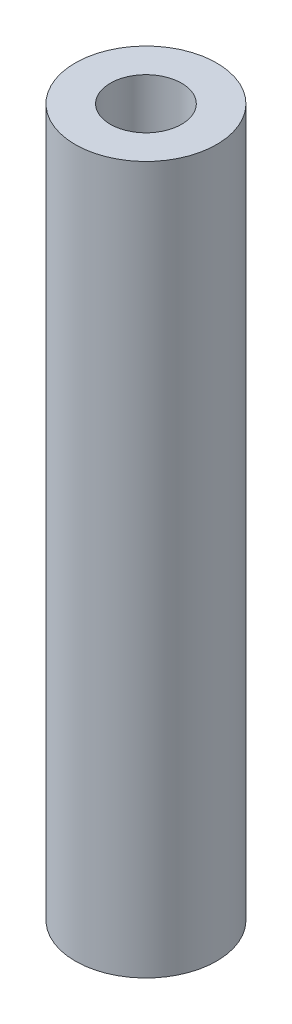
ISO-10303-21;
HEADER;
FILE_DESCRIPTION(('STEP AP214'),'2;1');
FILE_NAME('part.step','',(''),(''),'','','');
FILE_SCHEMA(('AUTOMOTIVE_DESIGN { 1 0 10303 214 1 1 1 1 }'));
ENDSEC;
DATA;
#1=APPLICATION_CONTEXT('core data for automotive mechanical design processes');
#2=APPLICATION_PROTOCOL_DEFINITION('international standard','automotive_design',2000,#1);
#3=PRODUCT_CONTEXT('',#1,'mechanical');
#4=PRODUCT('Part','Part','',(#3));
#5=PRODUCT_RELATED_PRODUCT_CATEGORY('part','',(#4));
#6=PRODUCT_DEFINITION_FORMATION('','',#4);
#7=PRODUCT_DEFINITION_CONTEXT('part definition',#1,'design');
#8=PRODUCT_DEFINITION('design','',#6,#7);
#9=PRODUCT_DEFINITION_SHAPE('','',#8);
#10=(LENGTH_UNIT() NAMED_UNIT(*) SI_UNIT(.MILLI.,.METRE.));
#11=(NAMED_UNIT(*) PLANE_ANGLE_UNIT() SI_UNIT($,.RADIAN.));
#12=(NAMED_UNIT(*) SI_UNIT($,.STERADIAN.) SOLID_ANGLE_UNIT());
#13=UNCERTAINTY_MEASURE_WITH_UNIT(LENGTH_MEASURE(1.E-05),#10,'distance_accuracy_value','');
#14=(GEOMETRIC_REPRESENTATION_CONTEXT(3) GLOBAL_UNCERTAINTY_ASSIGNED_CONTEXT((#13)) GLOBAL_UNIT_ASSIGNED_CONTEXT((#10,
#11,#12)) REPRESENTATION_CONTEXT('',''));
#15=CARTESIAN_POINT('',(0.,0.,0.));
#16=DIRECTION('',(0.,0.,1.));
#17=DIRECTION('',(1.,0.,0.));
#18=AXIS2_PLACEMENT_3D('',#15,#16,#17);
#19=CARTESIAN_POINT('',(0.,63.5,0.));
#20=DIRECTION('',(0.,1.,0.));
#21=DIRECTION('',(0.,0.,1.));
#22=AXIS2_PLACEMENT_3D('',#19,#20,#21);
#23=PLANE('',#22);
#24=CARTESIAN_POINT('',(0.,63.5,0.));
#25=DIRECTION('',(0.,1.,0.));
#26=DIRECTION('',(0.,0.,1.));
#27=AXIS2_PLACEMENT_3D('',#24,#25,#26);
#28=CIRCLE('',#27,6.35);
#29=CARTESIAN_POINT('',(0.,63.5,6.35));
#30=VERTEX_POINT('',#29);
#31=EDGE_CURVE('E10',#30,#30,#28,.T.);
#32=ORIENTED_EDGE('',*,*,#31,.T.);
#33=EDGE_LOOP('',(#32));
#34=FACE_BOUND('',#33,.T.);
#35=CARTESIAN_POINT('',(0.,63.5,0.));
#36=DIRECTION('',(0.,1.,0.));
#37=DIRECTION('',(0.,0.,1.));
#38=AXIS2_PLACEMENT_3D('',#35,#36,#37);
#39=CIRCLE('',#38,3.2004);
#40=CARTESIAN_POINT('',(0.,63.5,3.2004));
#41=VERTEX_POINT('',#40);
#42=EDGE_CURVE('E42',#41,#41,#39,.T.);
#43=ORIENTED_EDGE('',*,*,#42,.F.);
#44=EDGE_LOOP('',(#43));
#45=FACE_BOUND('',#44,.T.);
#46=ADVANCED_FACE('F31',(#34,#45),#23,.T.);
#47=CARTESIAN_POINT('',(0.,0.,0.));
#48=DIRECTION('',(0.,1.,0.));
#49=DIRECTION('',(0.,0.,1.));
#50=AXIS2_PLACEMENT_3D('',#47,#48,#49);
#51=PLANE('',#50);
#52=CARTESIAN_POINT('',(0.,0.,0.));
#53=DIRECTION('',(0.,1.,0.));
#54=DIRECTION('',(0.,0.,1.));
#55=AXIS2_PLACEMENT_3D('',#52,#53,#54);
#56=CIRCLE('',#55,6.35);
#57=CARTESIAN_POINT('',(0.,0.,6.35));
#58=VERTEX_POINT('',#57);
#59=EDGE_CURVE('E35',#58,#58,#56,.T.);
#60=ORIENTED_EDGE('',*,*,#59,.F.);
#61=EDGE_LOOP('',(#60));
#62=FACE_BOUND('',#61,.T.);
#63=CARTESIAN_POINT('',(0.,0.,0.));
#64=DIRECTION('',(0.,1.,0.));
#65=DIRECTION('',(0.,0.,1.));
#66=AXIS2_PLACEMENT_3D('',#63,#64,#65);
#67=CIRCLE('',#66,3.2004);
#68=CARTESIAN_POINT('',(0.,0.,3.2004));
#69=VERTEX_POINT('',#68);
#70=EDGE_CURVE('E44',#69,#69,#67,.T.);
#71=ORIENTED_EDGE('',*,*,#70,.T.);
#72=EDGE_LOOP('',(#71));
#73=FACE_BOUND('',#72,.T.);
#74=ADVANCED_FACE('F54',(#62,#73),#51,.F.);
#75=CARTESIAN_POINT('',(0.,63.5,0.));
#76=DIRECTION('',(0.,-1.,0.));
#77=DIRECTION('',(0.,0.,-1.));
#78=AXIS2_PLACEMENT_3D('',#75,#76,#77);
#79=CYLINDRICAL_SURFACE('',#78,6.35);
#80=ORIENTED_EDGE('',*,*,#31,.F.);
#81=EDGE_LOOP('',(#80));
#82=FACE_BOUND('',#81,.T.);
#83=ORIENTED_EDGE('',*,*,#59,.T.);
#84=EDGE_LOOP('',(#83));
#85=FACE_BOUND('',#84,.T.);
#86=ADVANCED_FACE('F33',(#82,#85),#79,.T.);
#87=CARTESIAN_POINT('',(0.,63.5,0.));
#88=DIRECTION('',(0.,-1.,0.));
#89=DIRECTION('',(0.,0.,-1.));
#90=AXIS2_PLACEMENT_3D('',#87,#88,#89);
#91=CYLINDRICAL_SURFACE('',#90,3.2004);
#92=ORIENTED_EDGE('',*,*,#42,.T.);
#93=EDGE_LOOP('',(#92));
#94=FACE_BOUND('',#93,.T.);
#95=ORIENTED_EDGE('',*,*,#70,.F.);
#96=EDGE_LOOP('',(#95));
#97=FACE_BOUND('',#96,.T.);
#98=ADVANCED_FACE('F50',(#94,#97),#91,.F.);
#99=CLOSED_SHELL('',(#46,#74,#86,#98));
#100=MANIFOLD_SOLID_BREP('B2',#99);
#101=ADVANCED_BREP_SHAPE_REPRESENTATION('',(#18,#100),#14);
#102=SHAPE_DEFINITION_REPRESENTATION(#9,#101);
ENDSEC;
END-ISO-10303-21;
